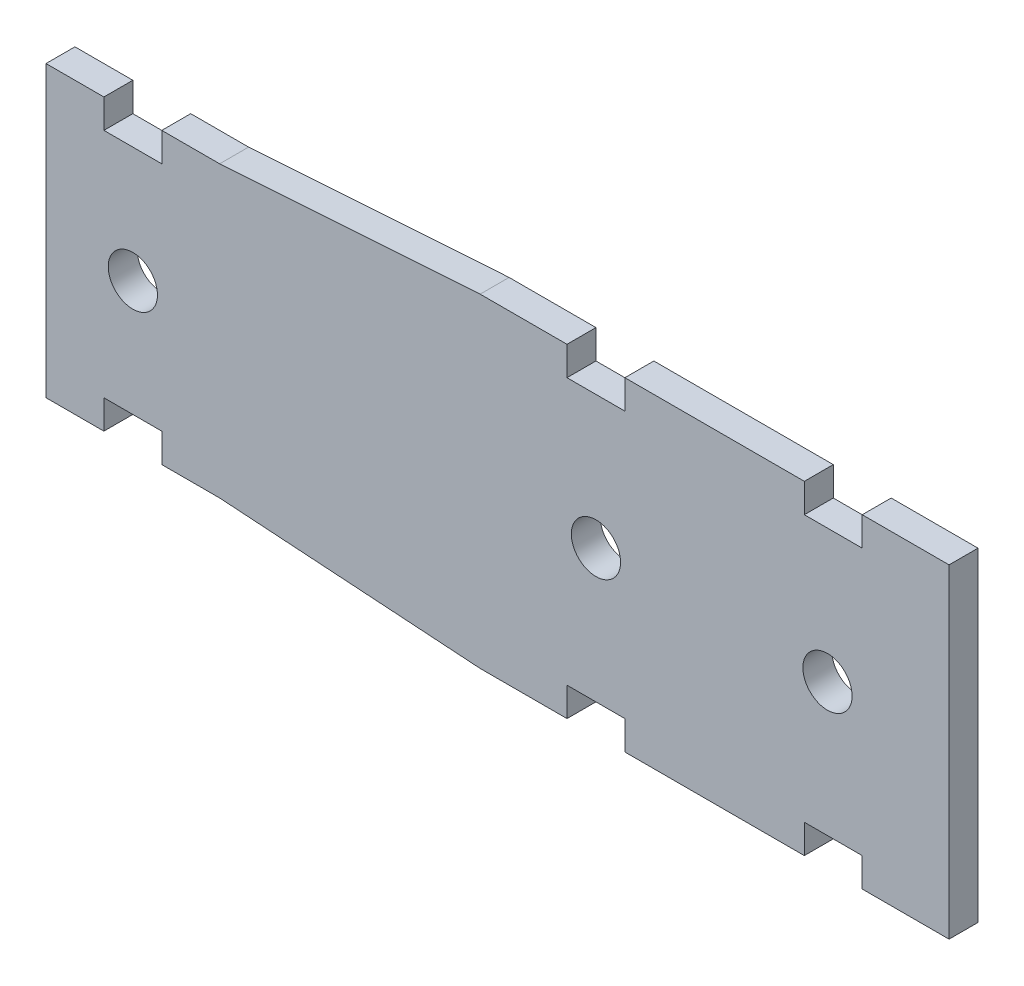
ISO-10303-21;
HEADER;
FILE_DESCRIPTION(('STEP AP214'),'2;1');
FILE_NAME('part.step','',(''),(''),'','','');
FILE_SCHEMA(('AUTOMOTIVE_DESIGN { 1 0 10303 214 1 1 1 1 }'));
ENDSEC;
DATA;
#1=APPLICATION_CONTEXT('core data for automotive mechanical design processes');
#2=APPLICATION_PROTOCOL_DEFINITION('international standard','automotive_design',2000,#1);
#3=PRODUCT_CONTEXT('',#1,'mechanical');
#4=PRODUCT('Part','Part','',(#3));
#5=PRODUCT_RELATED_PRODUCT_CATEGORY('part','',(#4));
#6=PRODUCT_DEFINITION_FORMATION('','',#4);
#7=PRODUCT_DEFINITION_CONTEXT('part definition',#1,'design');
#8=PRODUCT_DEFINITION('design','',#6,#7);
#9=PRODUCT_DEFINITION_SHAPE('','',#8);
#10=(LENGTH_UNIT() NAMED_UNIT(*) SI_UNIT(.MILLI.,.METRE.));
#11=(NAMED_UNIT(*) PLANE_ANGLE_UNIT() SI_UNIT($,.RADIAN.));
#12=(NAMED_UNIT(*) SI_UNIT($,.STERADIAN.) SOLID_ANGLE_UNIT());
#13=UNCERTAINTY_MEASURE_WITH_UNIT(LENGTH_MEASURE(1.E-05),#10,'distance_accuracy_value','');
#14=(GEOMETRIC_REPRESENTATION_CONTEXT(3) GLOBAL_UNCERTAINTY_ASSIGNED_CONTEXT((#13)) GLOBAL_UNIT_ASSIGNED_CONTEXT((#10,
#11,#12)) REPRESENTATION_CONTEXT('',''));
#15=CARTESIAN_POINT('',(0.,0.,0.));
#16=DIRECTION('',(0.,0.,1.));
#17=DIRECTION('',(1.,0.,0.));
#18=AXIS2_PLACEMENT_3D('',#15,#16,#17);
#19=CARTESIAN_POINT('',(-50.,0.,2.5));
#20=DIRECTION('',(-1.,0.,0.));
#21=DIRECTION('',(0.,0.,1.));
#22=AXIS2_PLACEMENT_3D('',#19,#20,#21);
#23=PLANE('',#22);
#24=DIRECTION('',(0.,1.,0.));
#25=VECTOR('',#24,1.);
#26=CARTESIAN_POINT('',(-50.,0.,-2.5));
#27=LINE('',#26,#25);
#28=CARTESIAN_POINT('',(-50.,-25.,-2.5));
#29=VERTEX_POINT('',#28);
#30=CARTESIAN_POINT('',(-50.,25.,-2.5));
#31=VERTEX_POINT('',#30);
#32=EDGE_CURVE('E279',#29,#31,#27,.T.);
#33=ORIENTED_EDGE('',*,*,#32,.F.);
#34=DIRECTION('',(0.,0.,-1.));
#35=VECTOR('',#34,1.);
#36=CARTESIAN_POINT('',(-50.,-25.,2.5));
#37=LINE('',#36,#35);
#38=CARTESIAN_POINT('',(-50.,-25.,2.5));
#39=VERTEX_POINT('',#38);
#40=EDGE_CURVE('E11',#39,#29,#37,.T.);
#41=ORIENTED_EDGE('',*,*,#40,.F.);
#42=DIRECTION('',(0.,1.,0.));
#43=VECTOR('',#42,1.);
#44=CARTESIAN_POINT('',(-50.,0.,2.5));
#45=LINE('',#44,#43);
#46=CARTESIAN_POINT('',(-50.,25.,2.5));
#47=VERTEX_POINT('',#46);
#48=EDGE_CURVE('E358',#39,#47,#45,.T.);
#49=ORIENTED_EDGE('',*,*,#48,.T.);
#50=DIRECTION('',(0.,0.,-1.));
#51=VECTOR('',#50,1.);
#52=CARTESIAN_POINT('',(-50.,25.,2.5));
#53=LINE('',#52,#51);
#54=EDGE_CURVE('E57',#47,#31,#53,.T.);
#55=ORIENTED_EDGE('',*,*,#54,.T.);
#56=EDGE_LOOP('',(#33,#41,#49,#55));
#57=FACE_BOUND('',#56,.T.);
#58=ADVANCED_FACE('F41',(#57),#23,.T.);
#59=CARTESIAN_POINT('',(0.,-25.,2.5));
#60=DIRECTION('',(0.,1.,0.));
#61=DIRECTION('',(0.,0.,1.));
#62=AXIS2_PLACEMENT_3D('',#59,#60,#61);
#63=PLANE('',#62);
#64=DIRECTION('',(1.,0.,0.));
#65=VECTOR('',#64,1.);
#66=CARTESIAN_POINT('',(0.,-25.,-2.5));
#67=LINE('',#66,#65);
#68=CARTESIAN_POINT('',(-40.,-25.,-2.5));
#69=VERTEX_POINT('',#68);
#70=EDGE_CURVE('E281',#29,#69,#67,.T.);
#71=ORIENTED_EDGE('',*,*,#70,.T.);
#72=DIRECTION('',(0.,0.,-1.));
#73=VECTOR('',#72,1.);
#74=CARTESIAN_POINT('',(-40.,-25.,2.5));
#75=LINE('',#74,#73);
#76=CARTESIAN_POINT('',(-40.,-25.,2.5));
#77=VERTEX_POINT('',#76);
#78=EDGE_CURVE('E49',#77,#69,#75,.T.);
#79=ORIENTED_EDGE('',*,*,#78,.F.);
#80=DIRECTION('',(1.,0.,0.));
#81=VECTOR('',#80,1.);
#82=CARTESIAN_POINT('',(0.,-25.,2.5));
#83=LINE('',#82,#81);
#84=EDGE_CURVE('E714',#39,#77,#83,.T.);
#85=ORIENTED_EDGE('',*,*,#84,.F.);
#86=ORIENTED_EDGE('',*,*,#40,.T.);
#87=EDGE_LOOP('',(#71,#79,#85,#86));
#88=FACE_BOUND('',#87,.T.);
#89=ADVANCED_FACE('F526',(#88),#63,.F.);
#90=CARTESIAN_POINT('',(-40.,0.,2.5));
#91=DIRECTION('',(-1.,0.,0.));
#92=DIRECTION('',(0.,-1.,0.));
#93=AXIS2_PLACEMENT_3D('',#90,#91,#92);
#94=PLANE('',#93);
#95=DIRECTION('',(0.,1.,0.));
#96=VECTOR('',#95,1.);
#97=CARTESIAN_POINT('',(-40.,0.,-2.5));
#98=LINE('',#97,#96);
#99=CARTESIAN_POINT('',(-40.,-20.,-2.5));
#100=VERTEX_POINT('',#99);
#101=EDGE_CURVE('E284',#69,#100,#98,.T.);
#102=ORIENTED_EDGE('',*,*,#101,.T.);
#103=DIRECTION('',(0.,0.,-1.));
#104=VECTOR('',#103,1.);
#105=CARTESIAN_POINT('',(-40.,-20.,2.5));
#106=LINE('',#105,#104);
#107=CARTESIAN_POINT('',(-40.,-20.,2.5));
#108=VERTEX_POINT('',#107);
#109=EDGE_CURVE('E422',#108,#100,#106,.T.);
#110=ORIENTED_EDGE('',*,*,#109,.F.);
#111=DIRECTION('',(0.,1.,0.));
#112=VECTOR('',#111,1.);
#113=CARTESIAN_POINT('',(-40.,0.,2.5));
#114=LINE('',#113,#112);
#115=EDGE_CURVE('E431',#77,#108,#114,.T.);
#116=ORIENTED_EDGE('',*,*,#115,.F.);
#117=ORIENTED_EDGE('',*,*,#78,.T.);
#118=EDGE_LOOP('',(#102,#110,#116,#117));
#119=FACE_BOUND('',#118,.T.);
#120=ADVANCED_FACE('F429',(#119),#94,.F.);
#121=CARTESIAN_POINT('',(0.,-20.,2.5));
#122=DIRECTION('',(0.,1.,0.));
#123=DIRECTION('',(-1.,0.,0.));
#124=AXIS2_PLACEMENT_3D('',#121,#122,#123);
#125=PLANE('',#124);
#126=DIRECTION('',(1.,0.,0.));
#127=VECTOR('',#126,1.);
#128=CARTESIAN_POINT('',(0.,-20.,-2.5));
#129=LINE('',#128,#127);
#130=CARTESIAN_POINT('',(-30.,-20.,-2.5));
#131=VERTEX_POINT('',#130);
#132=EDGE_CURVE('E286',#100,#131,#129,.T.);
#133=ORIENTED_EDGE('',*,*,#132,.T.);
#134=DIRECTION('',(0.,0.,-1.));
#135=VECTOR('',#134,1.);
#136=CARTESIAN_POINT('',(-30.,-20.,2.5));
#137=LINE('',#136,#135);
#138=CARTESIAN_POINT('',(-30.,-20.,2.5));
#139=VERTEX_POINT('',#138);
#140=EDGE_CURVE('E419',#139,#131,#137,.T.);
#141=ORIENTED_EDGE('',*,*,#140,.F.);
#142=DIRECTION('',(1.,0.,0.));
#143=VECTOR('',#142,1.);
#144=CARTESIAN_POINT('',(0.,-20.,2.5));
#145=LINE('',#144,#143);
#146=EDGE_CURVE('E450',#108,#139,#145,.T.);
#147=ORIENTED_EDGE('',*,*,#146,.F.);
#148=ORIENTED_EDGE('',*,*,#109,.T.);
#149=EDGE_LOOP('',(#133,#141,#147,#148));
#150=FACE_BOUND('',#149,.T.);
#151=ADVANCED_FACE('F441',(#150),#125,.F.);
#152=CARTESIAN_POINT('',(-30.,0.,2.5));
#153=DIRECTION('',(1.,0.,0.));
#154=DIRECTION('',(0.,0.,-1.));
#155=AXIS2_PLACEMENT_3D('',#152,#153,#154);
#156=PLANE('',#155);
#157=DIRECTION('',(0.,-1.,0.));
#158=VECTOR('',#157,1.);
#159=CARTESIAN_POINT('',(-30.,0.,-2.5));
#160=LINE('',#159,#158);
#161=CARTESIAN_POINT('',(-30.,-25.,-2.5));
#162=VERTEX_POINT('',#161);
#163=EDGE_CURVE('E288',#131,#162,#160,.T.);
#164=ORIENTED_EDGE('',*,*,#163,.T.);
#165=DIRECTION('',(0.,0.,-1.));
#166=VECTOR('',#165,1.);
#167=CARTESIAN_POINT('',(-30.,-25.,2.5));
#168=LINE('',#167,#166);
#169=CARTESIAN_POINT('',(-30.,-25.,2.5));
#170=VERTEX_POINT('',#169);
#171=EDGE_CURVE('E416',#170,#162,#168,.T.);
#172=ORIENTED_EDGE('',*,*,#171,.F.);
#173=DIRECTION('',(0.,-1.,0.));
#174=VECTOR('',#173,1.);
#175=CARTESIAN_POINT('',(-30.,0.,2.5));
#176=LINE('',#175,#174);
#177=EDGE_CURVE('E447',#139,#170,#176,.T.);
#178=ORIENTED_EDGE('',*,*,#177,.F.);
#179=ORIENTED_EDGE('',*,*,#140,.T.);
#180=EDGE_LOOP('',(#164,#172,#178,#179));
#181=FACE_BOUND('',#180,.T.);
#182=ADVANCED_FACE('F445',(#181),#156,.F.);
#183=CARTESIAN_POINT('',(0.,-25.,2.5));
#184=DIRECTION('',(0.,1.,0.));
#185=DIRECTION('',(-1.,0.,0.));
#186=AXIS2_PLACEMENT_3D('',#183,#184,#185);
#187=PLANE('',#186);
#188=DIRECTION('',(1.,0.,0.));
#189=VECTOR('',#188,1.);
#190=CARTESIAN_POINT('',(0.,-25.,-2.5));
#191=LINE('',#190,#189);
#192=CARTESIAN_POINT('',(-20.,-25.,-2.5));
#193=VERTEX_POINT('',#192);
#194=EDGE_CURVE('E290',#162,#193,#191,.T.);
#195=ORIENTED_EDGE('',*,*,#194,.T.);
#196=DIRECTION('',(0.,0.,-1.));
#197=VECTOR('',#196,1.);
#198=CARTESIAN_POINT('',(-20.,-25.,2.5));
#199=LINE('',#198,#197);
#200=CARTESIAN_POINT('',(-20.,-25.,2.5));
#201=VERTEX_POINT('',#200);
#202=EDGE_CURVE('E413',#201,#193,#199,.T.);
#203=ORIENTED_EDGE('',*,*,#202,.F.);
#204=DIRECTION('',(1.,0.,0.));
#205=VECTOR('',#204,1.);
#206=CARTESIAN_POINT('',(0.,-25.,2.5));
#207=LINE('',#206,#205);
#208=EDGE_CURVE('E449',#170,#201,#207,.T.);
#209=ORIENTED_EDGE('',*,*,#208,.F.);
#210=ORIENTED_EDGE('',*,*,#171,.T.);
#211=EDGE_LOOP('',(#195,#203,#209,#210));
#212=FACE_BOUND('',#211,.T.);
#213=ADVANCED_FACE('F539',(#212),#187,.F.);
#214=CARTESIAN_POINT('',(-1.74778761061947,-26.216814159292,2.5));
#215=DIRECTION('',(0.066519010523774,0.997785157856609,0.));
#216=DIRECTION('',(-0.997785157856609,0.066519010523774,0.));
#217=AXIS2_PLACEMENT_3D('',#214,#215,#216);
#218=PLANE('',#217);
#219=DIRECTION('',(0.997785157856609,-0.066519010523774,0.));
#220=VECTOR('',#219,1.);
#221=CARTESIAN_POINT('',(-1.74778761061947,-26.216814159292,-2.5));
#222=LINE('',#221,#220);
#223=CARTESIAN_POINT('',(25.,-28.,-2.5));
#224=VERTEX_POINT('',#223);
#225=EDGE_CURVE('E292',#193,#224,#222,.T.);
#226=ORIENTED_EDGE('',*,*,#225,.T.);
#227=DIRECTION('',(0.,0.,-1.));
#228=VECTOR('',#227,1.);
#229=CARTESIAN_POINT('',(25.,-28.,2.5));
#230=LINE('',#229,#228);
#231=CARTESIAN_POINT('',(25.,-28.,2.5));
#232=VERTEX_POINT('',#231);
#233=EDGE_CURVE('E410',#232,#224,#230,.T.);
#234=ORIENTED_EDGE('',*,*,#233,.F.);
#235=DIRECTION('',(0.997785157856609,-0.066519010523774,0.));
#236=VECTOR('',#235,1.);
#237=CARTESIAN_POINT('',(-1.74778761061947,-26.216814159292,2.5));
#238=LINE('',#237,#236);
#239=EDGE_CURVE('E452',#201,#232,#238,.T.);
#240=ORIENTED_EDGE('',*,*,#239,.F.);
#241=ORIENTED_EDGE('',*,*,#202,.T.);
#242=EDGE_LOOP('',(#226,#234,#240,#241));
#243=FACE_BOUND('',#242,.T.);
#244=ADVANCED_FACE('F542',(#243),#218,.F.);
#245=CARTESIAN_POINT('',(0.,-28.,2.5));
#246=DIRECTION('',(0.,1.,0.));
#247=DIRECTION('',(0.,0.,1.));
#248=AXIS2_PLACEMENT_3D('',#245,#246,#247);
#249=PLANE('',#248);
#250=DIRECTION('',(1.,0.,0.));
#251=VECTOR('',#250,1.);
#252=CARTESIAN_POINT('',(0.,-28.,-2.5));
#253=LINE('',#252,#251);
#254=CARTESIAN_POINT('',(40.,-28.,-2.5));
#255=VERTEX_POINT('',#254);
#256=EDGE_CURVE('E294',#224,#255,#253,.T.);
#257=ORIENTED_EDGE('',*,*,#256,.T.);
#258=DIRECTION('',(0.,0.,-1.));
#259=VECTOR('',#258,1.);
#260=CARTESIAN_POINT('',(40.,-28.,2.5));
#261=LINE('',#260,#259);
#262=CARTESIAN_POINT('',(40.,-28.,2.5));
#263=VERTEX_POINT('',#262);
#264=EDGE_CURVE('E407',#263,#255,#261,.T.);
#265=ORIENTED_EDGE('',*,*,#264,.F.);
#266=DIRECTION('',(1.,0.,0.));
#267=VECTOR('',#266,1.);
#268=CARTESIAN_POINT('',(0.,-28.,2.5));
#269=LINE('',#268,#267);
#270=EDGE_CURVE('E458',#232,#263,#269,.T.);
#271=ORIENTED_EDGE('',*,*,#270,.F.);
#272=ORIENTED_EDGE('',*,*,#233,.T.);
#273=EDGE_LOOP('',(#257,#265,#271,#272));
#274=FACE_BOUND('',#273,.T.);
#275=ADVANCED_FACE('F546',(#274),#249,.F.);
#276=CARTESIAN_POINT('',(40.,0.,2.5));
#277=DIRECTION('',(-1.,0.,0.));
#278=DIRECTION('',(0.,-1.,0.));
#279=AXIS2_PLACEMENT_3D('',#276,#277,#278);
#280=PLANE('',#279);
#281=DIRECTION('',(0.,1.,0.));
#282=VECTOR('',#281,1.);
#283=CARTESIAN_POINT('',(40.,0.,-2.5));
#284=LINE('',#283,#282);
#285=CARTESIAN_POINT('',(40.,-23.,-2.5));
#286=VERTEX_POINT('',#285);
#287=EDGE_CURVE('E296',#255,#286,#284,.T.);
#288=ORIENTED_EDGE('',*,*,#287,.T.);
#289=DIRECTION('',(0.,0.,-1.));
#290=VECTOR('',#289,1.);
#291=CARTESIAN_POINT('',(40.,-23.,2.5));
#292=LINE('',#291,#290);
#293=CARTESIAN_POINT('',(40.,-23.,2.5));
#294=VERTEX_POINT('',#293);
#295=EDGE_CURVE('E405',#294,#286,#292,.T.);
#296=ORIENTED_EDGE('',*,*,#295,.F.);
#297=DIRECTION('',(0.,1.,0.));
#298=VECTOR('',#297,1.);
#299=CARTESIAN_POINT('',(40.,0.,2.5));
#300=LINE('',#299,#298);
#301=EDGE_CURVE('E460',#263,#294,#300,.T.);
#302=ORIENTED_EDGE('',*,*,#301,.F.);
#303=ORIENTED_EDGE('',*,*,#264,.T.);
#304=EDGE_LOOP('',(#288,#296,#302,#303));
#305=FACE_BOUND('',#304,.T.);
#306=ADVANCED_FACE('F550',(#305),#280,.F.);
#307=CARTESIAN_POINT('',(0.,-23.,2.5));
#308=DIRECTION('',(0.,-1.,0.));
#309=DIRECTION('',(1.,0.,0.));
#310=AXIS2_PLACEMENT_3D('',#307,#308,#309);
#311=PLANE('',#310);
#312=DIRECTION('',(-1.,0.,0.));
#313=VECTOR('',#312,1.);
#314=CARTESIAN_POINT('',(0.,-23.,-2.5));
#315=LINE('',#314,#313);
#316=CARTESIAN_POINT('',(50.,-23.,-2.5));
#317=VERTEX_POINT('',#316);
#318=EDGE_CURVE('E299',#317,#286,#315,.T.);
#319=ORIENTED_EDGE('',*,*,#318,.F.);
#320=DIRECTION('',(0.,0.,-1.));
#321=VECTOR('',#320,1.);
#322=CARTESIAN_POINT('',(50.,-23.,2.5));
#323=LINE('',#322,#321);
#324=CARTESIAN_POINT('',(50.,-23.,2.5));
#325=VERTEX_POINT('',#324);
#326=EDGE_CURVE('E403',#325,#317,#323,.T.);
#327=ORIENTED_EDGE('',*,*,#326,.F.);
#328=DIRECTION('',(-1.,0.,0.));
#329=VECTOR('',#328,1.);
#330=CARTESIAN_POINT('',(0.,-23.,2.5));
#331=LINE('',#330,#329);
#332=EDGE_CURVE('E462',#325,#294,#331,.T.);
#333=ORIENTED_EDGE('',*,*,#332,.T.);
#334=ORIENTED_EDGE('',*,*,#295,.T.);
#335=EDGE_LOOP('',(#319,#327,#333,#334));
#336=FACE_BOUND('',#335,.T.);
#337=ADVANCED_FACE('F554',(#336),#311,.T.);
#338=CARTESIAN_POINT('',(50.,0.,2.5));
#339=DIRECTION('',(-1.,0.,0.));
#340=DIRECTION('',(0.,0.,1.));
#341=AXIS2_PLACEMENT_3D('',#338,#339,#340);
#342=PLANE('',#341);
#343=DIRECTION('',(0.,1.,0.));
#344=VECTOR('',#343,1.);
#345=CARTESIAN_POINT('',(50.,0.,-2.5));
#346=LINE('',#345,#344);
#347=CARTESIAN_POINT('',(50.,-28.,-2.5));
#348=VERTEX_POINT('',#347);
#349=EDGE_CURVE('E302',#348,#317,#346,.T.);
#350=ORIENTED_EDGE('',*,*,#349,.F.);
#351=DIRECTION('',(0.,0.,-1.));
#352=VECTOR('',#351,1.);
#353=CARTESIAN_POINT('',(50.,-28.,2.5));
#354=LINE('',#353,#352);
#355=CARTESIAN_POINT('',(50.,-28.,2.5));
#356=VERTEX_POINT('',#355);
#357=EDGE_CURVE('E401',#356,#348,#354,.T.);
#358=ORIENTED_EDGE('',*,*,#357,.F.);
#359=DIRECTION('',(0.,1.,0.));
#360=VECTOR('',#359,1.);
#361=CARTESIAN_POINT('',(50.,0.,2.5));
#362=LINE('',#361,#360);
#363=EDGE_CURVE('E465',#356,#325,#362,.T.);
#364=ORIENTED_EDGE('',*,*,#363,.T.);
#365=ORIENTED_EDGE('',*,*,#326,.T.);
#366=EDGE_LOOP('',(#350,#358,#364,#365));
#367=FACE_BOUND('',#366,.T.);
#368=ADVANCED_FACE('F558',(#367),#342,.T.);
#369=CARTESIAN_POINT('',(0.,-28.,2.5));
#370=DIRECTION('',(0.,1.,0.));
#371=DIRECTION('',(-1.,0.,0.));
#372=AXIS2_PLACEMENT_3D('',#369,#370,#371);
#373=PLANE('',#372);
#374=DIRECTION('',(1.,0.,0.));
#375=VECTOR('',#374,1.);
#376=CARTESIAN_POINT('',(0.,-28.,-2.5));
#377=LINE('',#376,#375);
#378=CARTESIAN_POINT('',(81.,-28.,-2.5));
#379=VERTEX_POINT('',#378);
#380=EDGE_CURVE('E305',#348,#379,#377,.T.);
#381=ORIENTED_EDGE('',*,*,#380,.T.);
#382=DIRECTION('',(0.,0.,-1.));
#383=VECTOR('',#382,1.);
#384=CARTESIAN_POINT('',(81.,-28.,2.5));
#385=LINE('',#384,#383);
#386=CARTESIAN_POINT('',(81.,-28.,2.5));
#387=VERTEX_POINT('',#386);
#388=EDGE_CURVE('E398',#387,#379,#385,.T.);
#389=ORIENTED_EDGE('',*,*,#388,.F.);
#390=DIRECTION('',(1.,0.,0.));
#391=VECTOR('',#390,1.);
#392=CARTESIAN_POINT('',(0.,-28.,2.5));
#393=LINE('',#392,#391);
#394=EDGE_CURVE('E468',#356,#387,#393,.T.);
#395=ORIENTED_EDGE('',*,*,#394,.F.);
#396=ORIENTED_EDGE('',*,*,#357,.T.);
#397=EDGE_LOOP('',(#381,#389,#395,#396));
#398=FACE_BOUND('',#397,.T.);
#399=ADVANCED_FACE('F562',(#398),#373,.F.);
#400=CARTESIAN_POINT('',(81.,0.,2.5));
#401=DIRECTION('',(-1.,0.,0.));
#402=DIRECTION('',(0.,0.,1.));
#403=AXIS2_PLACEMENT_3D('',#400,#401,#402);
#404=PLANE('',#403);
#405=DIRECTION('',(0.,1.,0.));
#406=VECTOR('',#405,1.);
#407=CARTESIAN_POINT('',(81.,0.,-2.5));
#408=LINE('',#407,#406);
#409=CARTESIAN_POINT('',(81.,-23.,-2.5));
#410=VERTEX_POINT('',#409);
#411=EDGE_CURVE('E307',#379,#410,#408,.T.);
#412=ORIENTED_EDGE('',*,*,#411,.T.);
#413=DIRECTION('',(0.,0.,-1.));
#414=VECTOR('',#413,1.);
#415=CARTESIAN_POINT('',(81.,-23.,2.5));
#416=LINE('',#415,#414);
#417=CARTESIAN_POINT('',(81.,-23.,2.5));
#418=VERTEX_POINT('',#417);
#419=EDGE_CURVE('E395',#418,#410,#416,.T.);
#420=ORIENTED_EDGE('',*,*,#419,.F.);
#421=DIRECTION('',(0.,1.,0.));
#422=VECTOR('',#421,1.);
#423=CARTESIAN_POINT('',(81.,0.,2.5));
#424=LINE('',#423,#422);
#425=EDGE_CURVE('E470',#387,#418,#424,.T.);
#426=ORIENTED_EDGE('',*,*,#425,.F.);
#427=ORIENTED_EDGE('',*,*,#388,.T.);
#428=EDGE_LOOP('',(#412,#420,#426,#427));
#429=FACE_BOUND('',#428,.T.);
#430=ADVANCED_FACE('F564',(#429),#404,.F.);
#431=CARTESIAN_POINT('',(0.,-23.,2.5));
#432=DIRECTION('',(0.,1.,0.));
#433=DIRECTION('',(-1.,0.,0.));
#434=AXIS2_PLACEMENT_3D('',#431,#432,#433);
#435=PLANE('',#434);
#436=DIRECTION('',(1.,0.,0.));
#437=VECTOR('',#436,1.);
#438=CARTESIAN_POINT('',(0.,-23.,-2.5));
#439=LINE('',#438,#437);
#440=CARTESIAN_POINT('',(91.,-23.,-2.5));
#441=VERTEX_POINT('',#440);
#442=EDGE_CURVE('E310',#410,#441,#439,.T.);
#443=ORIENTED_EDGE('',*,*,#442,.T.);
#444=DIRECTION('',(0.,0.,-1.));
#445=VECTOR('',#444,1.);
#446=CARTESIAN_POINT('',(91.,-23.,2.5));
#447=LINE('',#446,#445);
#448=CARTESIAN_POINT('',(91.,-23.,2.5));
#449=VERTEX_POINT('',#448);
#450=EDGE_CURVE('E392',#449,#441,#447,.T.);
#451=ORIENTED_EDGE('',*,*,#450,.F.);
#452=DIRECTION('',(1.,0.,0.));
#453=VECTOR('',#452,1.);
#454=CARTESIAN_POINT('',(0.,-23.,2.5));
#455=LINE('',#454,#453);
#456=EDGE_CURVE('E473',#418,#449,#455,.T.);
#457=ORIENTED_EDGE('',*,*,#456,.F.);
#458=ORIENTED_EDGE('',*,*,#419,.T.);
#459=EDGE_LOOP('',(#443,#451,#457,#458));
#460=FACE_BOUND('',#459,.T.);
#461=ADVANCED_FACE('F567',(#460),#435,.F.);
#462=CARTESIAN_POINT('',(91.,0.,2.5));
#463=DIRECTION('',(1.,0.,0.));
#464=DIRECTION('',(0.,0.,-1.));
#465=AXIS2_PLACEMENT_3D('',#462,#463,#464);
#466=PLANE('',#465);
#467=DIRECTION('',(0.,-1.,0.));
#468=VECTOR('',#467,1.);
#469=CARTESIAN_POINT('',(91.,0.,-2.5));
#470=LINE('',#469,#468);
#471=CARTESIAN_POINT('',(91.,-28.,-2.5));
#472=VERTEX_POINT('',#471);
#473=EDGE_CURVE('E312',#441,#472,#470,.T.);
#474=ORIENTED_EDGE('',*,*,#473,.T.);
#475=DIRECTION('',(0.,0.,-1.));
#476=VECTOR('',#475,1.);
#477=CARTESIAN_POINT('',(91.,-28.,2.5));
#478=LINE('',#477,#476);
#479=CARTESIAN_POINT('',(91.,-28.,2.5));
#480=VERTEX_POINT('',#479);
#481=EDGE_CURVE('E389',#480,#472,#478,.T.);
#482=ORIENTED_EDGE('',*,*,#481,.F.);
#483=DIRECTION('',(0.,-1.,0.));
#484=VECTOR('',#483,1.);
#485=CARTESIAN_POINT('',(91.,0.,2.5));
#486=LINE('',#485,#484);
#487=EDGE_CURVE('E475',#449,#480,#486,.T.);
#488=ORIENTED_EDGE('',*,*,#487,.F.);
#489=ORIENTED_EDGE('',*,*,#450,.T.);
#490=EDGE_LOOP('',(#474,#482,#488,#489));
#491=FACE_BOUND('',#490,.T.);
#492=ADVANCED_FACE('F571',(#491),#466,.F.);
#493=CARTESIAN_POINT('',(106.,-28.,-2.5));
#494=VERTEX_POINT('',#493);
#495=EDGE_CURVE('E308',#472,#494,#377,.T.);
#496=ORIENTED_EDGE('',*,*,#495,.T.);
#497=DIRECTION('',(0.,0.,-1.));
#498=VECTOR('',#497,1.);
#499=CARTESIAN_POINT('',(106.,-28.,2.5));
#500=LINE('',#499,#498);
#501=CARTESIAN_POINT('',(106.,-28.,2.5));
#502=VERTEX_POINT('',#501);
#503=EDGE_CURVE('E387',#502,#494,#500,.T.);
#504=ORIENTED_EDGE('',*,*,#503,.F.);
#505=EDGE_CURVE('E471',#480,#502,#393,.T.);
#506=ORIENTED_EDGE('',*,*,#505,.F.);
#507=ORIENTED_EDGE('',*,*,#481,.T.);
#508=EDGE_LOOP('',(#496,#504,#506,#507));
#509=FACE_BOUND('',#508,.T.);
#510=ADVANCED_FACE('F575',(#509),#373,.F.);
#511=CARTESIAN_POINT('',(106.,0.,2.5));
#512=DIRECTION('',(1.,0.,0.));
#513=DIRECTION('',(0.,0.,-1.));
#514=AXIS2_PLACEMENT_3D('',#511,#512,#513);
#515=PLANE('',#514);
#516=DIRECTION('',(0.,-1.,0.));
#517=VECTOR('',#516,1.);
#518=CARTESIAN_POINT('',(106.,0.,-2.5));
#519=LINE('',#518,#517);
#520=CARTESIAN_POINT('',(106.,28.,-2.5));
#521=VERTEX_POINT('',#520);
#522=EDGE_CURVE('E314',#521,#494,#519,.T.);
#523=ORIENTED_EDGE('',*,*,#522,.F.);
#524=DIRECTION('',(0.,0.,-1.));
#525=VECTOR('',#524,1.);
#526=CARTESIAN_POINT('',(106.,28.,2.5));
#527=LINE('',#526,#525);
#528=CARTESIAN_POINT('',(106.,28.,2.5));
#529=VERTEX_POINT('',#528);
#530=EDGE_CURVE('E385',#529,#521,#527,.T.);
#531=ORIENTED_EDGE('',*,*,#530,.F.);
#532=DIRECTION('',(0.,-1.,0.));
#533=VECTOR('',#532,1.);
#534=CARTESIAN_POINT('',(106.,0.,2.5));
#535=LINE('',#534,#533);
#536=EDGE_CURVE('E477',#529,#502,#535,.T.);
#537=ORIENTED_EDGE('',*,*,#536,.T.);
#538=ORIENTED_EDGE('',*,*,#503,.T.);
#539=EDGE_LOOP('',(#523,#531,#537,#538));
#540=FACE_BOUND('',#539,.T.);
#541=ADVANCED_FACE('F579',(#540),#515,.T.);
#542=CARTESIAN_POINT('',(0.,28.,2.5));
#543=DIRECTION('',(0.,1.,0.));
#544=DIRECTION('',(-1.,0.,0.));
#545=AXIS2_PLACEMENT_3D('',#542,#543,#544);
#546=PLANE('',#545);
#547=DIRECTION('',(1.,0.,0.));
#548=VECTOR('',#547,1.);
#549=CARTESIAN_POINT('',(0.,28.,-2.5));
#550=LINE('',#549,#548);
#551=CARTESIAN_POINT('',(91.,28.,-2.5));
#552=VERTEX_POINT('',#551);
#553=EDGE_CURVE('E317',#552,#521,#550,.T.);
#554=ORIENTED_EDGE('',*,*,#553,.F.);
#555=DIRECTION('',(0.,0.,-1.));
#556=VECTOR('',#555,1.);
#557=CARTESIAN_POINT('',(91.,28.,2.5));
#558=LINE('',#557,#556);
#559=CARTESIAN_POINT('',(91.,28.,2.5));
#560=VERTEX_POINT('',#559);
#561=EDGE_CURVE('E383',#560,#552,#558,.T.);
#562=ORIENTED_EDGE('',*,*,#561,.F.);
#563=DIRECTION('',(1.,0.,0.));
#564=VECTOR('',#563,1.);
#565=CARTESIAN_POINT('',(0.,28.,2.5));
#566=LINE('',#565,#564);
#567=EDGE_CURVE('E480',#560,#529,#566,.T.);
#568=ORIENTED_EDGE('',*,*,#567,.T.);
#569=ORIENTED_EDGE('',*,*,#530,.T.);
#570=EDGE_LOOP('',(#554,#562,#568,#569));
#571=FACE_BOUND('',#570,.T.);
#572=ADVANCED_FACE('F583',(#571),#546,.T.);
#573=CARTESIAN_POINT('',(91.,0.,2.5));
#574=DIRECTION('',(-1.,0.,0.));
#575=DIRECTION('',(0.,0.,1.));
#576=AXIS2_PLACEMENT_3D('',#573,#574,#575);
#577=PLANE('',#576);
#578=DIRECTION('',(0.,1.,0.));
#579=VECTOR('',#578,1.);
#580=CARTESIAN_POINT('',(91.,0.,-2.5));
#581=LINE('',#580,#579);
#582=CARTESIAN_POINT('',(91.,23.,-2.5));
#583=VERTEX_POINT('',#582);
#584=EDGE_CURVE('E320',#583,#552,#581,.T.);
#585=ORIENTED_EDGE('',*,*,#584,.F.);
#586=DIRECTION('',(0.,0.,-1.));
#587=VECTOR('',#586,1.);
#588=CARTESIAN_POINT('',(91.,23.,2.5));
#589=LINE('',#588,#587);
#590=CARTESIAN_POINT('',(91.,23.,2.5));
#591=VERTEX_POINT('',#590);
#592=EDGE_CURVE('E381',#591,#583,#589,.T.);
#593=ORIENTED_EDGE('',*,*,#592,.F.);
#594=DIRECTION('',(0.,1.,0.));
#595=VECTOR('',#594,1.);
#596=CARTESIAN_POINT('',(91.,0.,2.5));
#597=LINE('',#596,#595);
#598=EDGE_CURVE('E483',#591,#560,#597,.T.);
#599=ORIENTED_EDGE('',*,*,#598,.T.);
#600=ORIENTED_EDGE('',*,*,#561,.T.);
#601=EDGE_LOOP('',(#585,#593,#599,#600));
#602=FACE_BOUND('',#601,.T.);
#603=ADVANCED_FACE('F587',(#602),#577,.T.);
#604=CARTESIAN_POINT('',(0.,23.,2.5));
#605=DIRECTION('',(0.,1.,0.));
#606=DIRECTION('',(-1.,0.,0.));
#607=AXIS2_PLACEMENT_3D('',#604,#605,#606);
#608=PLANE('',#607);
#609=DIRECTION('',(1.,0.,0.));
#610=VECTOR('',#609,1.);
#611=CARTESIAN_POINT('',(0.,23.,-2.5));
#612=LINE('',#611,#610);
#613=CARTESIAN_POINT('',(81.,23.,-2.5));
#614=VERTEX_POINT('',#613);
#615=EDGE_CURVE('E323',#614,#583,#612,.T.);
#616=ORIENTED_EDGE('',*,*,#615,.F.);
#617=DIRECTION('',(0.,0.,-1.));
#618=VECTOR('',#617,1.);
#619=CARTESIAN_POINT('',(81.,23.,2.5));
#620=LINE('',#619,#618);
#621=CARTESIAN_POINT('',(81.,23.,2.5));
#622=VERTEX_POINT('',#621);
#623=EDGE_CURVE('E379',#622,#614,#620,.T.);
#624=ORIENTED_EDGE('',*,*,#623,.F.);
#625=DIRECTION('',(1.,0.,0.));
#626=VECTOR('',#625,1.);
#627=CARTESIAN_POINT('',(0.,23.,2.5));
#628=LINE('',#627,#626);
#629=EDGE_CURVE('E486',#622,#591,#628,.T.);
#630=ORIENTED_EDGE('',*,*,#629,.T.);
#631=ORIENTED_EDGE('',*,*,#592,.T.);
#632=EDGE_LOOP('',(#616,#624,#630,#631));
#633=FACE_BOUND('',#632,.T.);
#634=ADVANCED_FACE('F591',(#633),#608,.T.);
#635=CARTESIAN_POINT('',(81.,0.,2.5));
#636=DIRECTION('',(1.,0.,0.));
#637=DIRECTION('',(0.,0.,-1.));
#638=AXIS2_PLACEMENT_3D('',#635,#636,#637);
#639=PLANE('',#638);
#640=DIRECTION('',(0.,-1.,0.));
#641=VECTOR('',#640,1.);
#642=CARTESIAN_POINT('',(81.,0.,-2.5));
#643=LINE('',#642,#641);
#644=CARTESIAN_POINT('',(81.,28.,-2.5));
#645=VERTEX_POINT('',#644);
#646=EDGE_CURVE('E326',#645,#614,#643,.T.);
#647=ORIENTED_EDGE('',*,*,#646,.F.);
#648=DIRECTION('',(0.,0.,-1.));
#649=VECTOR('',#648,1.);
#650=CARTESIAN_POINT('',(81.,28.,2.5));
#651=LINE('',#650,#649);
#652=CARTESIAN_POINT('',(81.,28.,2.5));
#653=VERTEX_POINT('',#652);
#654=EDGE_CURVE('E377',#653,#645,#651,.T.);
#655=ORIENTED_EDGE('',*,*,#654,.F.);
#656=DIRECTION('',(0.,-1.,0.));
#657=VECTOR('',#656,1.);
#658=CARTESIAN_POINT('',(81.,0.,2.5));
#659=LINE('',#658,#657);
#660=EDGE_CURVE('E489',#653,#622,#659,.T.);
#661=ORIENTED_EDGE('',*,*,#660,.T.);
#662=ORIENTED_EDGE('',*,*,#623,.T.);
#663=EDGE_LOOP('',(#647,#655,#661,#662));
#664=FACE_BOUND('',#663,.T.);
#665=ADVANCED_FACE('F595',(#664),#639,.T.);
#666=CARTESIAN_POINT('',(0.,28.,2.5));
#667=DIRECTION('',(0.,1.,0.));
#668=DIRECTION('',(0.,0.,1.));
#669=AXIS2_PLACEMENT_3D('',#666,#667,#668);
#670=PLANE('',#669);
#671=DIRECTION('',(1.,0.,0.));
#672=VECTOR('',#671,1.);
#673=CARTESIAN_POINT('',(0.,28.,-2.5));
#674=LINE('',#673,#672);
#675=CARTESIAN_POINT('',(50.,28.,-2.5));
#676=VERTEX_POINT('',#675);
#677=EDGE_CURVE('E329',#676,#645,#674,.T.);
#678=ORIENTED_EDGE('',*,*,#677,.F.);
#679=DIRECTION('',(0.,0.,-1.));
#680=VECTOR('',#679,1.);
#681=CARTESIAN_POINT('',(50.,28.,2.5));
#682=LINE('',#681,#680);
#683=CARTESIAN_POINT('',(50.,28.,2.5));
#684=VERTEX_POINT('',#683);
#685=EDGE_CURVE('E375',#684,#676,#682,.T.);
#686=ORIENTED_EDGE('',*,*,#685,.F.);
#687=DIRECTION('',(1.,0.,0.));
#688=VECTOR('',#687,1.);
#689=CARTESIAN_POINT('',(0.,28.,2.5));
#690=LINE('',#689,#688);
#691=EDGE_CURVE('E492',#684,#653,#690,.T.);
#692=ORIENTED_EDGE('',*,*,#691,.T.);
#693=ORIENTED_EDGE('',*,*,#654,.T.);
#694=EDGE_LOOP('',(#678,#686,#692,#693));
#695=FACE_BOUND('',#694,.T.);
#696=ADVANCED_FACE('F599',(#695),#670,.T.);
#697=CARTESIAN_POINT('',(50.,0.,2.5));
#698=DIRECTION('',(1.,0.,0.));
#699=DIRECTION('',(0.,0.,-1.));
#700=AXIS2_PLACEMENT_3D('',#697,#698,#699);
#701=PLANE('',#700);
#702=DIRECTION('',(0.,-1.,0.));
#703=VECTOR('',#702,1.);
#704=CARTESIAN_POINT('',(50.,0.,-2.5));
#705=LINE('',#704,#703);
#706=CARTESIAN_POINT('',(50.,23.,-2.5));
#707=VERTEX_POINT('',#706);
#708=EDGE_CURVE('E332',#676,#707,#705,.T.);
#709=ORIENTED_EDGE('',*,*,#708,.T.);
#710=DIRECTION('',(0.,0.,-1.));
#711=VECTOR('',#710,1.);
#712=CARTESIAN_POINT('',(50.,23.,2.5));
#713=LINE('',#712,#711);
#714=CARTESIAN_POINT('',(50.,23.,2.5));
#715=VERTEX_POINT('',#714);
#716=EDGE_CURVE('E372',#715,#707,#713,.T.);
#717=ORIENTED_EDGE('',*,*,#716,.F.);
#718=DIRECTION('',(0.,-1.,0.));
#719=VECTOR('',#718,1.);
#720=CARTESIAN_POINT('',(50.,0.,2.5));
#721=LINE('',#720,#719);
#722=EDGE_CURVE('E495',#684,#715,#721,.T.);
#723=ORIENTED_EDGE('',*,*,#722,.F.);
#724=ORIENTED_EDGE('',*,*,#685,.T.);
#725=EDGE_LOOP('',(#709,#717,#723,#724));
#726=FACE_BOUND('',#725,.T.);
#727=ADVANCED_FACE('F603',(#726),#701,.F.);
#728=CARTESIAN_POINT('',(0.,23.,2.5));
#729=DIRECTION('',(0.,-1.,0.));
#730=DIRECTION('',(1.,0.,0.));
#731=AXIS2_PLACEMENT_3D('',#728,#729,#730);
#732=PLANE('',#731);
#733=DIRECTION('',(-1.,0.,0.));
#734=VECTOR('',#733,1.);
#735=CARTESIAN_POINT('',(0.,23.,-2.5));
#736=LINE('',#735,#734);
#737=CARTESIAN_POINT('',(40.,23.,-2.5));
#738=VERTEX_POINT('',#737);
#739=EDGE_CURVE('E334',#707,#738,#736,.T.);
#740=ORIENTED_EDGE('',*,*,#739,.T.);
#741=DIRECTION('',(0.,0.,-1.));
#742=VECTOR('',#741,1.);
#743=CARTESIAN_POINT('',(40.,23.,2.5));
#744=LINE('',#743,#742);
#745=CARTESIAN_POINT('',(40.,23.,2.5));
#746=VERTEX_POINT('',#745);
#747=EDGE_CURVE('E370',#746,#738,#744,.T.);
#748=ORIENTED_EDGE('',*,*,#747,.F.);
#749=DIRECTION('',(-1.,0.,0.));
#750=VECTOR('',#749,1.);
#751=CARTESIAN_POINT('',(0.,23.,2.5));
#752=LINE('',#751,#750);
#753=EDGE_CURVE('E497',#715,#746,#752,.T.);
#754=ORIENTED_EDGE('',*,*,#753,.F.);
#755=ORIENTED_EDGE('',*,*,#716,.T.);
#756=EDGE_LOOP('',(#740,#748,#754,#755));
#757=FACE_BOUND('',#756,.T.);
#758=ADVANCED_FACE('F607',(#757),#732,.F.);
#759=CARTESIAN_POINT('',(40.,0.,2.5));
#760=DIRECTION('',(1.,0.,0.));
#761=DIRECTION('',(0.,1.,0.));
#762=AXIS2_PLACEMENT_3D('',#759,#760,#761);
#763=PLANE('',#762);
#764=DIRECTION('',(0.,-1.,0.));
#765=VECTOR('',#764,1.);
#766=CARTESIAN_POINT('',(40.,0.,-2.5));
#767=LINE('',#766,#765);
#768=CARTESIAN_POINT('',(40.,28.,-2.5));
#769=VERTEX_POINT('',#768);
#770=EDGE_CURVE('E337',#769,#738,#767,.T.);
#771=ORIENTED_EDGE('',*,*,#770,.F.);
#772=DIRECTION('',(0.,0.,-1.));
#773=VECTOR('',#772,1.);
#774=CARTESIAN_POINT('',(40.,28.,2.5));
#775=LINE('',#774,#773);
#776=CARTESIAN_POINT('',(40.,28.,2.5));
#777=VERTEX_POINT('',#776);
#778=EDGE_CURVE('E368',#777,#769,#775,.T.);
#779=ORIENTED_EDGE('',*,*,#778,.F.);
#780=DIRECTION('',(0.,-1.,0.));
#781=VECTOR('',#780,1.);
#782=CARTESIAN_POINT('',(40.,0.,2.5));
#783=LINE('',#782,#781);
#784=EDGE_CURVE('E499',#777,#746,#783,.T.);
#785=ORIENTED_EDGE('',*,*,#784,.T.);
#786=ORIENTED_EDGE('',*,*,#747,.T.);
#787=EDGE_LOOP('',(#771,#779,#785,#786));
#788=FACE_BOUND('',#787,.T.);
#789=ADVANCED_FACE('F611',(#788),#763,.T.);
#790=CARTESIAN_POINT('',(0.,28.,2.5));
#791=DIRECTION('',(0.,1.,0.));
#792=DIRECTION('',(0.,0.,1.));
#793=AXIS2_PLACEMENT_3D('',#790,#791,#792);
#794=PLANE('',#793);
#795=DIRECTION('',(1.,0.,0.));
#796=VECTOR('',#795,1.);
#797=CARTESIAN_POINT('',(0.,28.,-2.5));
#798=LINE('',#797,#796);
#799=CARTESIAN_POINT('',(25.,28.,-2.5));
#800=VERTEX_POINT('',#799);
#801=EDGE_CURVE('E340',#800,#769,#798,.T.);
#802=ORIENTED_EDGE('',*,*,#801,.F.);
#803=DIRECTION('',(0.,0.,-1.));
#804=VECTOR('',#803,1.);
#805=CARTESIAN_POINT('',(25.,28.,2.5));
#806=LINE('',#805,#804);
#807=CARTESIAN_POINT('',(25.,28.,2.5));
#808=VERTEX_POINT('',#807);
#809=EDGE_CURVE('E366',#808,#800,#806,.T.);
#810=ORIENTED_EDGE('',*,*,#809,.F.);
#811=DIRECTION('',(1.,0.,0.));
#812=VECTOR('',#811,1.);
#813=CARTESIAN_POINT('',(0.,28.,2.5));
#814=LINE('',#813,#812);
#815=EDGE_CURVE('E502',#808,#777,#814,.T.);
#816=ORIENTED_EDGE('',*,*,#815,.T.);
#817=ORIENTED_EDGE('',*,*,#778,.T.);
#818=EDGE_LOOP('',(#802,#810,#816,#817));
#819=FACE_BOUND('',#818,.T.);
#820=ADVANCED_FACE('F615',(#819),#794,.T.);
#821=CARTESIAN_POINT('',(-1.74778761061947,26.216814159292,2.5));
#822=DIRECTION('',(-0.066519010523774,0.997785157856609,0.));
#823=DIRECTION('',(-0.997785157856609,-0.066519010523774,0.));
#824=AXIS2_PLACEMENT_3D('',#821,#822,#823);
#825=PLANE('',#824);
#826=DIRECTION('',(0.997785157856609,0.066519010523774,0.));
#827=VECTOR('',#826,1.);
#828=CARTESIAN_POINT('',(-1.74778761061947,26.216814159292,-2.5));
#829=LINE('',#828,#827);
#830=CARTESIAN_POINT('',(-20.,25.,-2.5));
#831=VERTEX_POINT('',#830);
#832=EDGE_CURVE('E343',#831,#800,#829,.T.);
#833=ORIENTED_EDGE('',*,*,#832,.F.);
#834=DIRECTION('',(0.,0.,-1.));
#835=VECTOR('',#834,1.);
#836=CARTESIAN_POINT('',(-20.,25.,2.5));
#837=LINE('',#836,#835);
#838=CARTESIAN_POINT('',(-20.,25.,2.5));
#839=VERTEX_POINT('',#838);
#840=EDGE_CURVE('E364',#839,#831,#837,.T.);
#841=ORIENTED_EDGE('',*,*,#840,.F.);
#842=DIRECTION('',(0.997785157856609,0.066519010523774,0.));
#843=VECTOR('',#842,1.);
#844=CARTESIAN_POINT('',(-1.74778761061947,26.216814159292,2.5));
#845=LINE('',#844,#843);
#846=EDGE_CURVE('E505',#839,#808,#845,.T.);
#847=ORIENTED_EDGE('',*,*,#846,.T.);
#848=ORIENTED_EDGE('',*,*,#809,.T.);
#849=EDGE_LOOP('',(#833,#841,#847,#848));
#850=FACE_BOUND('',#849,.T.);
#851=ADVANCED_FACE('F619',(#850),#825,.T.);
#852=CARTESIAN_POINT('',(0.,25.,2.5));
#853=DIRECTION('',(0.,1.,0.));
#854=DIRECTION('',(-1.,0.,0.));
#855=AXIS2_PLACEMENT_3D('',#852,#853,#854);
#856=PLANE('',#855);
#857=DIRECTION('',(1.,0.,0.));
#858=VECTOR('',#857,1.);
#859=CARTESIAN_POINT('',(0.,25.,-2.5));
#860=LINE('',#859,#858);
#861=CARTESIAN_POINT('',(-30.,25.,-2.5));
#862=VERTEX_POINT('',#861);
#863=EDGE_CURVE('E346',#862,#831,#860,.T.);
#864=ORIENTED_EDGE('',*,*,#863,.F.);
#865=DIRECTION('',(0.,0.,-1.));
#866=VECTOR('',#865,1.);
#867=CARTESIAN_POINT('',(-30.,25.,2.5));
#868=LINE('',#867,#866);
#869=CARTESIAN_POINT('',(-30.,25.,2.5));
#870=VERTEX_POINT('',#869);
#871=EDGE_CURVE('E362',#870,#862,#868,.T.);
#872=ORIENTED_EDGE('',*,*,#871,.F.);
#873=DIRECTION('',(1.,0.,0.));
#874=VECTOR('',#873,1.);
#875=CARTESIAN_POINT('',(0.,25.,2.5));
#876=LINE('',#875,#874);
#877=EDGE_CURVE('E508',#870,#839,#876,.T.);
#878=ORIENTED_EDGE('',*,*,#877,.T.);
#879=ORIENTED_EDGE('',*,*,#840,.T.);
#880=EDGE_LOOP('',(#864,#872,#878,#879));
#881=FACE_BOUND('',#880,.T.);
#882=ADVANCED_FACE('F623',(#881),#856,.T.);
#883=CARTESIAN_POINT('',(-30.,0.,2.5));
#884=DIRECTION('',(-1.,0.,0.));
#885=DIRECTION('',(0.,0.,1.));
#886=AXIS2_PLACEMENT_3D('',#883,#884,#885);
#887=PLANE('',#886);
#888=DIRECTION('',(0.,1.,0.));
#889=VECTOR('',#888,1.);
#890=CARTESIAN_POINT('',(-30.,0.,-2.5));
#891=LINE('',#890,#889);
#892=CARTESIAN_POINT('',(-30.,20.,-2.5));
#893=VERTEX_POINT('',#892);
#894=EDGE_CURVE('E349',#893,#862,#891,.T.);
#895=ORIENTED_EDGE('',*,*,#894,.F.);
#896=DIRECTION('',(0.,0.,-1.));
#897=VECTOR('',#896,1.);
#898=CARTESIAN_POINT('',(-30.,20.,2.5));
#899=LINE('',#898,#897);
#900=CARTESIAN_POINT('',(-30.,20.,2.5));
#901=VERTEX_POINT('',#900);
#902=EDGE_CURVE('E260',#901,#893,#899,.T.);
#903=ORIENTED_EDGE('',*,*,#902,.F.);
#904=DIRECTION('',(0.,1.,0.));
#905=VECTOR('',#904,1.);
#906=CARTESIAN_POINT('',(-30.,0.,2.5));
#907=LINE('',#906,#905);
#908=EDGE_CURVE('E271',#901,#870,#907,.T.);
#909=ORIENTED_EDGE('',*,*,#908,.T.);
#910=ORIENTED_EDGE('',*,*,#871,.T.);
#911=EDGE_LOOP('',(#895,#903,#909,#910));
#912=FACE_BOUND('',#911,.T.);
#913=ADVANCED_FACE('F512',(#912),#887,.T.);
#914=CARTESIAN_POINT('',(0.,20.,2.5));
#915=DIRECTION('',(0.,1.,0.));
#916=DIRECTION('',(-1.,0.,0.));
#917=AXIS2_PLACEMENT_3D('',#914,#915,#916);
#918=PLANE('',#917);
#919=DIRECTION('',(1.,0.,0.));
#920=VECTOR('',#919,1.);
#921=CARTESIAN_POINT('',(0.,20.,-2.5));
#922=LINE('',#921,#920);
#923=CARTESIAN_POINT('',(-40.,20.,-2.5));
#924=VERTEX_POINT('',#923);
#925=EDGE_CURVE('E256',#924,#893,#922,.T.);
#926=ORIENTED_EDGE('',*,*,#925,.F.);
#927=DIRECTION('',(0.,0.,-1.));
#928=VECTOR('',#927,1.);
#929=CARTESIAN_POINT('',(-40.,20.,2.5));
#930=LINE('',#929,#928);
#931=CARTESIAN_POINT('',(-40.,20.,2.5));
#932=VERTEX_POINT('',#931);
#933=EDGE_CURVE('E251',#932,#924,#930,.T.);
#934=ORIENTED_EDGE('',*,*,#933,.F.);
#935=DIRECTION('',(1.,0.,0.));
#936=VECTOR('',#935,1.);
#937=CARTESIAN_POINT('',(0.,20.,2.5));
#938=LINE('',#937,#936);
#939=EDGE_CURVE('E254',#932,#901,#938,.T.);
#940=ORIENTED_EDGE('',*,*,#939,.T.);
#941=ORIENTED_EDGE('',*,*,#902,.T.);
#942=EDGE_LOOP('',(#926,#934,#940,#941));
#943=FACE_BOUND('',#942,.T.);
#944=ADVANCED_FACE('F253',(#943),#918,.T.);
#945=CARTESIAN_POINT('',(-40.,0.,2.5));
#946=DIRECTION('',(1.,0.,0.));
#947=DIRECTION('',(0.,1.,0.));
#948=AXIS2_PLACEMENT_3D('',#945,#946,#947);
#949=PLANE('',#948);
#950=DIRECTION('',(0.,-1.,0.));
#951=VECTOR('',#950,1.);
#952=CARTESIAN_POINT('',(-40.,0.,-2.5));
#953=LINE('',#952,#951);
#954=CARTESIAN_POINT('',(-40.,25.,-2.5));
#955=VERTEX_POINT('',#954);
#956=EDGE_CURVE('E353',#955,#924,#953,.T.);
#957=ORIENTED_EDGE('',*,*,#956,.F.);
#958=DIRECTION('',(0.,0.,-1.));
#959=VECTOR('',#958,1.);
#960=CARTESIAN_POINT('',(-40.,25.,2.5));
#961=LINE('',#960,#959);
#962=CARTESIAN_POINT('',(-40.,25.,2.5));
#963=VERTEX_POINT('',#962);
#964=EDGE_CURVE('E154',#963,#955,#961,.T.);
#965=ORIENTED_EDGE('',*,*,#964,.F.);
#966=DIRECTION('',(0.,-1.,0.));
#967=VECTOR('',#966,1.);
#968=CARTESIAN_POINT('',(-40.,0.,2.5));
#969=LINE('',#968,#967);
#970=EDGE_CURVE('E268',#963,#932,#969,.T.);
#971=ORIENTED_EDGE('',*,*,#970,.T.);
#972=ORIENTED_EDGE('',*,*,#933,.T.);
#973=EDGE_LOOP('',(#957,#965,#971,#972));
#974=FACE_BOUND('',#973,.T.);
#975=ADVANCED_FACE('F273',(#974),#949,.T.);
#976=CARTESIAN_POINT('',(0.,25.,2.5));
#977=DIRECTION('',(0.,1.,0.));
#978=DIRECTION('',(0.,0.,1.));
#979=AXIS2_PLACEMENT_3D('',#976,#977,#978);
#980=PLANE('',#979);
#981=DIRECTION('',(1.,0.,0.));
#982=VECTOR('',#981,1.);
#983=CARTESIAN_POINT('',(0.,25.,-2.5));
#984=LINE('',#983,#982);
#985=EDGE_CURVE('E355',#31,#955,#984,.T.);
#986=ORIENTED_EDGE('',*,*,#985,.F.);
#987=ORIENTED_EDGE('',*,*,#54,.F.);
#988=DIRECTION('',(1.,0.,0.));
#989=VECTOR('',#988,1.);
#990=CARTESIAN_POINT('',(0.,25.,2.5));
#991=LINE('',#990,#989);
#992=EDGE_CURVE('E274',#47,#963,#991,.T.);
#993=ORIENTED_EDGE('',*,*,#992,.T.);
#994=ORIENTED_EDGE('',*,*,#964,.T.);
#995=EDGE_LOOP('',(#986,#987,#993,#994));
#996=FACE_BOUND('',#995,.T.);
#997=ADVANCED_FACE('F514',(#996),#980,.T.);
#998=CARTESIAN_POINT('',(0.,0.,2.5));
#999=DIRECTION('',(0.,0.,1.));
#1000=DIRECTION('',(1.,0.,0.));
#1001=AXIS2_PLACEMENT_3D('',#998,#999,#1000);
#1002=PLANE('',#1001);
#1003=CARTESIAN_POINT('',(-35.,0.,2.5));
#1004=DIRECTION('',(0.,0.,1.));
#1005=DIRECTION('',(1.,0.,0.));
#1006=AXIS2_PLACEMENT_3D('',#1003,#1004,#1005);
#1007=CIRCLE('',#1006,4.25);
#1008=CARTESIAN_POINT('',(-30.75,0.,2.5));
#1009=VERTEX_POINT('',#1008);
#1010=EDGE_CURVE('E695',#1009,#1009,#1007,.T.);
#1011=ORIENTED_EDGE('',*,*,#1010,.F.);
#1012=EDGE_LOOP('',(#1011));
#1013=FACE_BOUND('',#1012,.T.);
#1014=CARTESIAN_POINT('',(45.,0.,2.5));
#1015=DIRECTION('',(0.,0.,1.));
#1016=DIRECTION('',(1.,0.,0.));
#1017=AXIS2_PLACEMENT_3D('',#1014,#1015,#1016);
#1018=CIRCLE('',#1017,4.25);
#1019=CARTESIAN_POINT('',(49.25,0.,2.5));
#1020=VERTEX_POINT('',#1019);
#1021=EDGE_CURVE('E699',#1020,#1020,#1018,.T.);
#1022=ORIENTED_EDGE('',*,*,#1021,.F.);
#1023=EDGE_LOOP('',(#1022));
#1024=FACE_BOUND('',#1023,.T.);
#1025=CARTESIAN_POINT('',(85.,0.,2.5));
#1026=DIRECTION('',(0.,0.,1.));
#1027=DIRECTION('',(1.,0.,0.));
#1028=AXIS2_PLACEMENT_3D('',#1025,#1026,#1027);
#1029=CIRCLE('',#1028,4.25000000000001);
#1030=CARTESIAN_POINT('',(89.25,0.,2.5));
#1031=VERTEX_POINT('',#1030);
#1032=EDGE_CURVE('E705',#1031,#1031,#1029,.T.);
#1033=ORIENTED_EDGE('',*,*,#1032,.F.);
#1034=EDGE_LOOP('',(#1033));
#1035=FACE_BOUND('',#1034,.T.);
#1036=ORIENTED_EDGE('',*,*,#48,.F.);
#1037=ORIENTED_EDGE('',*,*,#84,.T.);
#1038=ORIENTED_EDGE('',*,*,#115,.T.);
#1039=ORIENTED_EDGE('',*,*,#146,.T.);
#1040=ORIENTED_EDGE('',*,*,#177,.T.);
#1041=ORIENTED_EDGE('',*,*,#208,.T.);
#1042=ORIENTED_EDGE('',*,*,#239,.T.);
#1043=ORIENTED_EDGE('',*,*,#270,.T.);
#1044=ORIENTED_EDGE('',*,*,#301,.T.);
#1045=ORIENTED_EDGE('',*,*,#332,.F.);
#1046=ORIENTED_EDGE('',*,*,#363,.F.);
#1047=ORIENTED_EDGE('',*,*,#394,.T.);
#1048=ORIENTED_EDGE('',*,*,#425,.T.);
#1049=ORIENTED_EDGE('',*,*,#456,.T.);
#1050=ORIENTED_EDGE('',*,*,#487,.T.);
#1051=ORIENTED_EDGE('',*,*,#505,.T.);
#1052=ORIENTED_EDGE('',*,*,#536,.F.);
#1053=ORIENTED_EDGE('',*,*,#567,.F.);
#1054=ORIENTED_EDGE('',*,*,#598,.F.);
#1055=ORIENTED_EDGE('',*,*,#629,.F.);
#1056=ORIENTED_EDGE('',*,*,#660,.F.);
#1057=ORIENTED_EDGE('',*,*,#691,.F.);
#1058=ORIENTED_EDGE('',*,*,#722,.T.);
#1059=ORIENTED_EDGE('',*,*,#753,.T.);
#1060=ORIENTED_EDGE('',*,*,#784,.F.);
#1061=ORIENTED_EDGE('',*,*,#815,.F.);
#1062=ORIENTED_EDGE('',*,*,#846,.F.);
#1063=ORIENTED_EDGE('',*,*,#877,.F.);
#1064=ORIENTED_EDGE('',*,*,#908,.F.);
#1065=ORIENTED_EDGE('',*,*,#939,.F.);
#1066=ORIENTED_EDGE('',*,*,#970,.F.);
#1067=ORIENTED_EDGE('',*,*,#992,.F.);
#1068=EDGE_LOOP('',(#1036,#1037,#1038,#1039,#1040,#1041,#1042,#1043,#1044,#1045,#1046,#1047,
#1048,#1049,#1050,#1051,#1052,#1053,#1054,#1055,#1056,#1057,#1058,#1059,#1060,#1061,#1062,#1063,
#1064,#1065,#1066,#1067));
#1069=FACE_BOUND('',#1068,.T.);
#1070=ADVANCED_FACE('F266',(#1013,#1024,#1035,#1069),#1002,.T.);
#1071=CARTESIAN_POINT('',(0.,0.,-2.5));
#1072=DIRECTION('',(0.,0.,1.));
#1073=DIRECTION('',(1.,0.,0.));
#1074=AXIS2_PLACEMENT_3D('',#1071,#1072,#1073);
#1075=PLANE('',#1074);
#1076=CARTESIAN_POINT('',(-35.,0.,-2.5));
#1077=DIRECTION('',(0.,0.,1.));
#1078=DIRECTION('',(1.,0.,0.));
#1079=AXIS2_PLACEMENT_3D('',#1076,#1077,#1078);
#1080=CIRCLE('',#1079,4.25);
#1081=CARTESIAN_POINT('',(-30.75,0.,-2.5));
#1082=VERTEX_POINT('',#1081);
#1083=EDGE_CURVE('E282',#1082,#1082,#1080,.F.);
#1084=ORIENTED_EDGE('',*,*,#1083,.F.);
#1085=EDGE_LOOP('',(#1084));
#1086=FACE_BOUND('',#1085,.T.);
#1087=CARTESIAN_POINT('',(45.,0.,-2.5));
#1088=DIRECTION('',(0.,0.,1.));
#1089=DIRECTION('',(1.,0.,0.));
#1090=AXIS2_PLACEMENT_3D('',#1087,#1088,#1089);
#1091=CIRCLE('',#1090,4.25);
#1092=CARTESIAN_POINT('',(49.25,0.,-2.5));
#1093=VERTEX_POINT('',#1092);
#1094=EDGE_CURVE('E702',#1093,#1093,#1091,.F.);
#1095=ORIENTED_EDGE('',*,*,#1094,.F.);
#1096=EDGE_LOOP('',(#1095));
#1097=FACE_BOUND('',#1096,.T.);
#1098=CARTESIAN_POINT('',(85.,0.,-2.5));
#1099=DIRECTION('',(0.,0.,1.));
#1100=DIRECTION('',(1.,0.,0.));
#1101=AXIS2_PLACEMENT_3D('',#1098,#1099,#1100);
#1102=CIRCLE('',#1101,4.25000000000001);
#1103=CARTESIAN_POINT('',(89.25,0.,-2.5));
#1104=VERTEX_POINT('',#1103);
#1105=EDGE_CURVE('E708',#1104,#1104,#1102,.F.);
#1106=ORIENTED_EDGE('',*,*,#1105,.F.);
#1107=EDGE_LOOP('',(#1106));
#1108=FACE_BOUND('',#1107,.T.);
#1109=ORIENTED_EDGE('',*,*,#32,.T.);
#1110=ORIENTED_EDGE('',*,*,#985,.T.);
#1111=ORIENTED_EDGE('',*,*,#956,.T.);
#1112=ORIENTED_EDGE('',*,*,#925,.T.);
#1113=ORIENTED_EDGE('',*,*,#894,.T.);
#1114=ORIENTED_EDGE('',*,*,#863,.T.);
#1115=ORIENTED_EDGE('',*,*,#832,.T.);
#1116=ORIENTED_EDGE('',*,*,#801,.T.);
#1117=ORIENTED_EDGE('',*,*,#770,.T.);
#1118=ORIENTED_EDGE('',*,*,#739,.F.);
#1119=ORIENTED_EDGE('',*,*,#708,.F.);
#1120=ORIENTED_EDGE('',*,*,#677,.T.);
#1121=ORIENTED_EDGE('',*,*,#646,.T.);
#1122=ORIENTED_EDGE('',*,*,#615,.T.);
#1123=ORIENTED_EDGE('',*,*,#584,.T.);
#1124=ORIENTED_EDGE('',*,*,#553,.T.);
#1125=ORIENTED_EDGE('',*,*,#522,.T.);
#1126=ORIENTED_EDGE('',*,*,#495,.F.);
#1127=ORIENTED_EDGE('',*,*,#473,.F.);
#1128=ORIENTED_EDGE('',*,*,#442,.F.);
#1129=ORIENTED_EDGE('',*,*,#411,.F.);
#1130=ORIENTED_EDGE('',*,*,#380,.F.);
#1131=ORIENTED_EDGE('',*,*,#349,.T.);
#1132=ORIENTED_EDGE('',*,*,#318,.T.);
#1133=ORIENTED_EDGE('',*,*,#287,.F.);
#1134=ORIENTED_EDGE('',*,*,#256,.F.);
#1135=ORIENTED_EDGE('',*,*,#225,.F.);
#1136=ORIENTED_EDGE('',*,*,#194,.F.);
#1137=ORIENTED_EDGE('',*,*,#163,.F.);
#1138=ORIENTED_EDGE('',*,*,#132,.F.);
#1139=ORIENTED_EDGE('',*,*,#101,.F.);
#1140=ORIENTED_EDGE('',*,*,#70,.F.);
#1141=EDGE_LOOP('',(#1109,#1110,#1111,#1112,#1113,#1114,#1115,#1116,#1117,#1118,#1119,#1120,
#1121,#1122,#1123,#1124,#1125,#1126,#1127,#1128,#1129,#1130,#1131,#1132,#1133,#1134,#1135,#1136,
#1137,#1138,#1139,#1140));
#1142=FACE_BOUND('',#1141,.T.);
#1143=ADVANCED_FACE('F436',(#1086,#1097,#1108,#1142),#1075,.F.);
#1144=CARTESIAN_POINT('',(85.,0.,-2.501));
#1145=DIRECTION('',(0.,0.,1.));
#1146=DIRECTION('',(1.,0.,0.));
#1147=AXIS2_PLACEMENT_3D('',#1144,#1145,#1146);
#1148=CYLINDRICAL_SURFACE('',#1147,4.25000000000001);
#1149=ORIENTED_EDGE('',*,*,#1032,.T.);
#1150=EDGE_LOOP('',(#1149));
#1151=FACE_BOUND('',#1150,.T.);
#1152=ORIENTED_EDGE('',*,*,#1105,.T.);
#1153=EDGE_LOOP('',(#1152));
#1154=FACE_BOUND('',#1153,.T.);
#1155=ADVANCED_FACE('F660',(#1151,#1154),#1148,.F.);
#1156=CARTESIAN_POINT('',(45.,0.,-2.501));
#1157=DIRECTION('',(0.,0.,1.));
#1158=DIRECTION('',(1.,0.,0.));
#1159=AXIS2_PLACEMENT_3D('',#1156,#1157,#1158);
#1160=CYLINDRICAL_SURFACE('',#1159,4.25);
#1161=ORIENTED_EDGE('',*,*,#1021,.T.);
#1162=EDGE_LOOP('',(#1161));
#1163=FACE_BOUND('',#1162,.T.);
#1164=ORIENTED_EDGE('',*,*,#1094,.T.);
#1165=EDGE_LOOP('',(#1164));
#1166=FACE_BOUND('',#1165,.T.);
#1167=ADVANCED_FACE('F669',(#1163,#1166),#1160,.F.);
#1168=CARTESIAN_POINT('',(-35.,0.,-2.501));
#1169=DIRECTION('',(0.,0.,1.));
#1170=DIRECTION('',(1.,0.,0.));
#1171=AXIS2_PLACEMENT_3D('',#1168,#1169,#1170);
#1172=CYLINDRICAL_SURFACE('',#1171,4.25);
#1173=ORIENTED_EDGE('',*,*,#1010,.T.);
#1174=EDGE_LOOP('',(#1173));
#1175=FACE_BOUND('',#1174,.T.);
#1176=ORIENTED_EDGE('',*,*,#1083,.T.);
#1177=EDGE_LOOP('',(#1176));
#1178=FACE_BOUND('',#1177,.T.);
#1179=ADVANCED_FACE('F679',(#1175,#1178),#1172,.F.);
#1180=CLOSED_SHELL('',(#58,#89,#120,#151,#182,#213,#244,#275,#306,#337,#368,#399,#430,#461,#492,
#510,#541,#572,#603,#634,#665,#696,#727,#758,#789,#820,#851,#882,#913,#944,#975,#997,#1070,
#1143,#1155,#1167,#1179));
#1181=MANIFOLD_SOLID_BREP('B2',#1180);
#1182=ADVANCED_BREP_SHAPE_REPRESENTATION('',(#18,#1181),#14);
#1183=SHAPE_DEFINITION_REPRESENTATION(#9,#1182);
ENDSEC;
END-ISO-10303-21;
